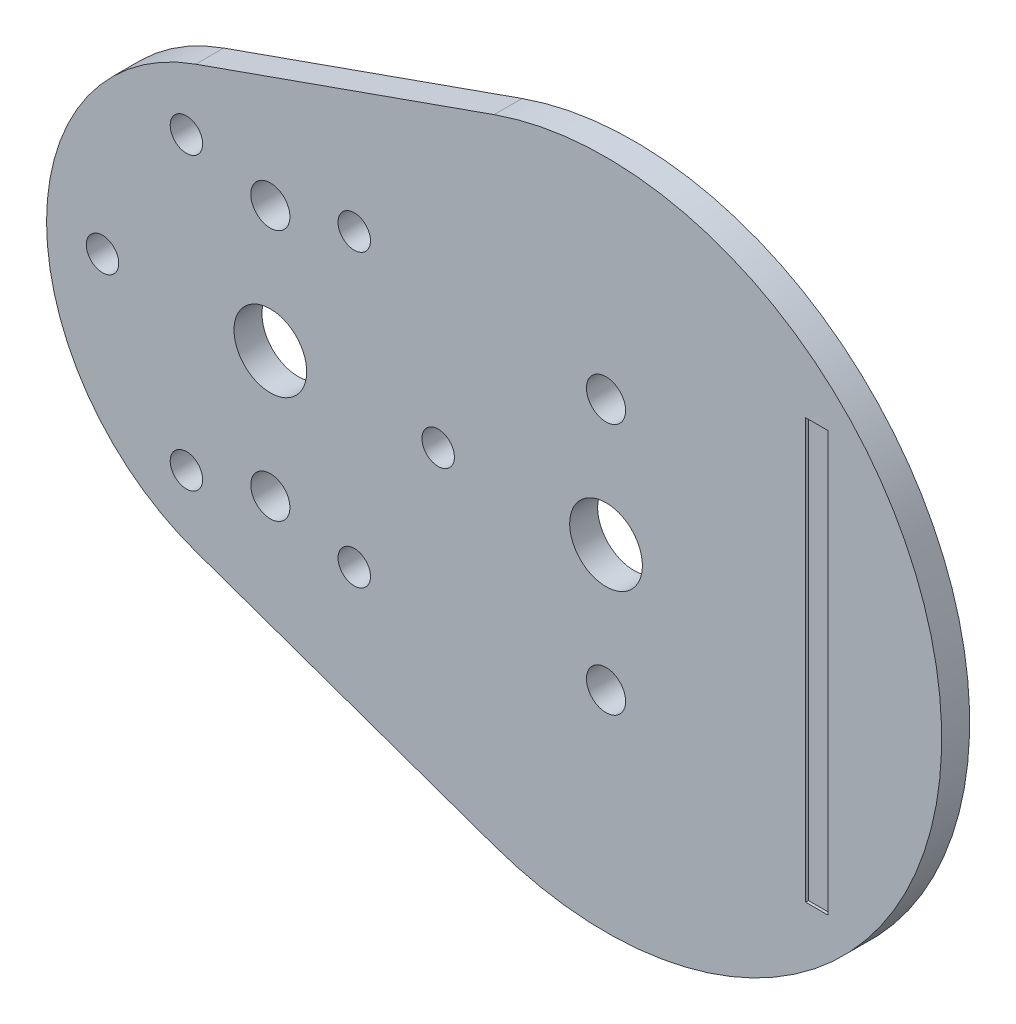
ISO-10303-21;
HEADER;
FILE_DESCRIPTION(('STEP AP214'),'2;1');
FILE_NAME('part.step','',(''),(''),'','','');
FILE_SCHEMA(('AUTOMOTIVE_DESIGN { 1 0 10303 214 1 1 1 1 }'));
ENDSEC;
DATA;
#1=APPLICATION_CONTEXT('core data for automotive mechanical design processes');
#2=APPLICATION_PROTOCOL_DEFINITION('international standard','automotive_design',2000,#1);
#3=PRODUCT_CONTEXT('',#1,'mechanical');
#4=PRODUCT('Part','Part','',(#3));
#5=PRODUCT_RELATED_PRODUCT_CATEGORY('part','',(#4));
#6=PRODUCT_DEFINITION_FORMATION('','',#4);
#7=PRODUCT_DEFINITION_CONTEXT('part definition',#1,'design');
#8=PRODUCT_DEFINITION('design','',#6,#7);
#9=PRODUCT_DEFINITION_SHAPE('','',#8);
#10=(LENGTH_UNIT() NAMED_UNIT(*) SI_UNIT(.MILLI.,.METRE.));
#11=(NAMED_UNIT(*) PLANE_ANGLE_UNIT() SI_UNIT($,.RADIAN.));
#12=(NAMED_UNIT(*) SI_UNIT($,.STERADIAN.) SOLID_ANGLE_UNIT());
#13=UNCERTAINTY_MEASURE_WITH_UNIT(LENGTH_MEASURE(1.E-05),#10,'distance_accuracy_value','');
#14=(GEOMETRIC_REPRESENTATION_CONTEXT(3) GLOBAL_UNCERTAINTY_ASSIGNED_CONTEXT((#13)) GLOBAL_UNIT_ASSIGNED_CONTEXT((#10,
#11,#12)) REPRESENTATION_CONTEXT('',''));
#15=CARTESIAN_POINT('',(0.,0.,0.));
#16=DIRECTION('',(0.,0.,1.));
#17=DIRECTION('',(1.,0.,0.));
#18=AXIS2_PLACEMENT_3D('',#15,#16,#17);
#19=CARTESIAN_POINT('',(0.,0.,5.));
#20=DIRECTION('',(0.,0.,-1.));
#21=DIRECTION('',(-1.,0.,0.));
#22=AXIS2_PLACEMENT_3D('',#19,#20,#21);
#23=PLANE('',#22);
#24=CARTESIAN_POINT('',(0.,0.,5.));
#25=DIRECTION('',(0.,0.,-1.));
#26=DIRECTION('',(-1.,0.,0.));
#27=AXIS2_PLACEMENT_3D('',#24,#25,#26);
#28=CIRCLE('',#27,60.);
#29=CARTESIAN_POINT('',(-20.,56.5685424949238,5.));
#30=VERTEX_POINT('',#29);
#31=CARTESIAN_POINT('',(-20.,-56.5685424949238,5.));
#32=VERTEX_POINT('',#31);
#33=EDGE_CURVE('E85',#30,#32,#28,.T.);
#34=ORIENTED_EDGE('',*,*,#33,.F.);
#35=DIRECTION('',(-0.942809041582063,-0.333333333333333,0.));
#36=VECTOR('',#35,1.);
#37=CARTESIAN_POINT('',(-20.,56.5685424949238,5.));
#38=LINE('',#37,#36);
#39=CARTESIAN_POINT('',(-73.3333333333333,37.7123616632826,5.));
#40=VERTEX_POINT('',#39);
#41=EDGE_CURVE('E195',#30,#40,#38,.T.);
#42=ORIENTED_EDGE('',*,*,#41,.T.);
#43=CARTESIAN_POINT('',(-60.,0.,5.));
#44=DIRECTION('',(0.,0.,-1.));
#45=DIRECTION('',(-1.,0.,0.));
#46=AXIS2_PLACEMENT_3D('',#43,#44,#45);
#47=CIRCLE('',#46,40.);
#48=CARTESIAN_POINT('',(-73.3333333333333,-37.7123616632825,5.));
#49=VERTEX_POINT('',#48);
#50=EDGE_CURVE('E192',#49,#40,#47,.T.);
#51=ORIENTED_EDGE('',*,*,#50,.F.);
#52=DIRECTION('',(0.942809041582063,-0.333333333333333,0.));
#53=VECTOR('',#52,1.);
#54=CARTESIAN_POINT('',(-73.3333333333333,-37.7123616632825,5.));
#55=LINE('',#54,#53);
#56=EDGE_CURVE('E189',#49,#32,#55,.T.);
#57=ORIENTED_EDGE('',*,*,#56,.T.);
#58=EDGE_LOOP('',(#34,#42,#51,#57));
#59=FACE_BOUND('',#58,.T.);
#60=CARTESIAN_POINT('',(3.95677291189683E-13,22.4999999999974,5.));
#61=DIRECTION('',(0.,0.,-1.));
#62=DIRECTION('',(-1.,0.,0.));
#63=AXIS2_PLACEMENT_3D('',#60,#61,#62);
#64=CIRCLE('',#63,3.49999999999999);
#65=CARTESIAN_POINT('',(-3.49999999999959,22.4999999999974,5.));
#66=VERTEX_POINT('',#65);
#67=EDGE_CURVE('E172',#66,#66,#64,.T.);
#68=ORIENTED_EDGE('',*,*,#67,.T.);
#69=EDGE_LOOP('',(#68));
#70=FACE_BOUND('',#69,.T.);
#71=CARTESIAN_POINT('',(3.95677291189683E-13,-22.5000000000026,5.));
#72=DIRECTION('',(0.,0.,-1.));
#73=DIRECTION('',(-1.,0.,0.));
#74=AXIS2_PLACEMENT_3D('',#71,#72,#73);
#75=CIRCLE('',#74,3.49999999999997);
#76=CARTESIAN_POINT('',(-3.49999999999958,-22.5000000000026,5.));
#77=VERTEX_POINT('',#76);
#78=EDGE_CURVE('E177',#77,#77,#75,.T.);
#79=ORIENTED_EDGE('',*,*,#78,.T.);
#80=EDGE_LOOP('',(#79));
#81=FACE_BOUND('',#80,.T.);
#82=CARTESIAN_POINT('',(-59.9999999999996,-22.5000000000026,5.));
#83=DIRECTION('',(0.,0.,-1.));
#84=DIRECTION('',(-1.,0.,0.));
#85=AXIS2_PLACEMENT_3D('',#82,#83,#84);
#86=CIRCLE('',#85,3.5);
#87=CARTESIAN_POINT('',(-63.4999999999996,-22.5000000000026,5.));
#88=VERTEX_POINT('',#87);
#89=EDGE_CURVE('E181',#88,#88,#86,.T.);
#90=ORIENTED_EDGE('',*,*,#89,.T.);
#91=EDGE_LOOP('',(#90));
#92=FACE_BOUND('',#91,.T.);
#93=CARTESIAN_POINT('',(-59.9999999999996,22.4999999999974,5.));
#94=DIRECTION('',(0.,0.,-1.));
#95=DIRECTION('',(-1.,0.,0.));
#96=AXIS2_PLACEMENT_3D('',#93,#94,#95);
#97=CIRCLE('',#96,3.5);
#98=CARTESIAN_POINT('',(-63.4999999999996,22.4999999999974,5.));
#99=VERTEX_POINT('',#98);
#100=EDGE_CURVE('E185',#99,#99,#97,.T.);
#101=ORIENTED_EDGE('',*,*,#100,.T.);
#102=EDGE_LOOP('',(#101));
#103=FACE_BOUND('',#102,.T.);
#104=CARTESIAN_POINT('',(-60.0000000000004,-1.97250984110758E-12,5.));
#105=DIRECTION('',(0.,0.,-1.));
#106=DIRECTION('',(0.,1.,0.));
#107=AXIS2_PLACEMENT_3D('',#104,#105,#106);
#108=CIRCLE('',#107,6.50000000000043);
#109=CARTESIAN_POINT('',(-60.0000000000004,6.49999999999846,5.));
#110=VERTEX_POINT('',#109);
#111=EDGE_CURVE('E165',#110,#110,#108,.T.);
#112=ORIENTED_EDGE('',*,*,#111,.T.);
#113=EDGE_LOOP('',(#112));
#114=FACE_BOUND('',#113,.T.);
#115=CARTESIAN_POINT('',(4.1286418728248E-13,-1.97424017550411E-12,5.));
#116=DIRECTION('',(0.,0.,-1.));
#117=DIRECTION('',(0.,1.,0.));
#118=AXIS2_PLACEMENT_3D('',#115,#116,#117);
#119=CIRCLE('',#118,6.49999999999999);
#120=CARTESIAN_POINT('',(4.1286418728248E-13,6.49999999999801,5.));
#121=VERTEX_POINT('',#120);
#122=EDGE_CURVE('E166',#121,#121,#119,.T.);
#123=ORIENTED_EDGE('',*,*,#122,.T.);
#124=EDGE_LOOP('',(#123));
#125=FACE_BOUND('',#124,.T.);
#126=CARTESIAN_POINT('',(-89.9999999999997,-1.32949725240404E-12,5.));
#127=DIRECTION('',(0.,0.,-1.));
#128=DIRECTION('',(-1.,0.,0.));
#129=AXIS2_PLACEMENT_3D('',#126,#127,#128);
#130=CIRCLE('',#129,2.89999999999999);
#131=CARTESIAN_POINT('',(-92.8999999999997,-1.32949725240404E-12,5.));
#132=VERTEX_POINT('',#131);
#133=EDGE_CURVE('E162',#132,#132,#130,.T.);
#134=ORIENTED_EDGE('',*,*,#133,.T.);
#135=EDGE_LOOP('',(#134));
#136=FACE_BOUND('',#135,.T.);
#137=CARTESIAN_POINT('',(-75.0000000000003,-25.9807621135349,5.));
#138=DIRECTION('',(0.,0.,-1.));
#139=DIRECTION('',(-1.,0.,0.));
#140=AXIS2_PLACEMENT_3D('',#137,#138,#139);
#141=CIRCLE('',#140,2.89999999999999);
#142=CARTESIAN_POINT('',(-77.9000000000002,-25.9807621135349,5.));
#143=VERTEX_POINT('',#142);
#144=EDGE_CURVE('E158',#143,#143,#141,.T.);
#145=ORIENTED_EDGE('',*,*,#144,.T.);
#146=EDGE_LOOP('',(#145));
#147=FACE_BOUND('',#146,.T.);
#148=CARTESIAN_POINT('',(-45.0000000000002,-25.9807621135356,5.));
#149=DIRECTION('',(0.,0.,-1.));
#150=DIRECTION('',(-1.,0.,0.));
#151=AXIS2_PLACEMENT_3D('',#148,#149,#150);
#152=CIRCLE('',#151,2.89999999999999);
#153=CARTESIAN_POINT('',(-47.9000000000002,-25.9807621135356,5.));
#154=VERTEX_POINT('',#153);
#155=EDGE_CURVE('E154',#154,#154,#152,.T.);
#156=ORIENTED_EDGE('',*,*,#155,.T.);
#157=EDGE_LOOP('',(#156));
#158=FACE_BOUND('',#157,.T.);
#159=CARTESIAN_POINT('',(-29.9999999999996,-2.69539052728573E-12,5.));
#160=DIRECTION('',(0.,0.,-1.));
#161=DIRECTION('',(-1.,0.,0.));
#162=AXIS2_PLACEMENT_3D('',#159,#160,#161);
#163=CIRCLE('',#162,2.89999999999999);
#164=CARTESIAN_POINT('',(-32.8999999999995,-2.69539052728573E-12,5.));
#165=VERTEX_POINT('',#164);
#166=EDGE_CURVE('E150',#165,#165,#163,.T.);
#167=ORIENTED_EDGE('',*,*,#166,.T.);
#168=EDGE_LOOP('',(#167));
#169=FACE_BOUND('',#168,.T.);
#170=CARTESIAN_POINT('',(-44.9999999999989,25.9807621135308,5.));
#171=DIRECTION('',(0.,0.,-1.));
#172=DIRECTION('',(-1.,0.,0.));
#173=AXIS2_PLACEMENT_3D('',#170,#171,#172);
#174=CIRCLE('',#173,2.89999999999999);
#175=CARTESIAN_POINT('',(-47.8999999999989,25.9807621135308,5.));
#176=VERTEX_POINT('',#175);
#177=EDGE_CURVE('E146',#176,#176,#174,.T.);
#178=ORIENTED_EDGE('',*,*,#177,.T.);
#179=EDGE_LOOP('',(#178));
#180=FACE_BOUND('',#179,.T.);
#181=CARTESIAN_POINT('',(-74.999999999999,25.9807621135315,5.));
#182=DIRECTION('',(0.,0.,-1.));
#183=DIRECTION('',(-1.,0.,0.));
#184=AXIS2_PLACEMENT_3D('',#181,#182,#183);
#185=CIRCLE('',#184,2.89999999999999);
#186=CARTESIAN_POINT('',(-77.899999999999,25.9807621135315,5.));
#187=VERTEX_POINT('',#186);
#188=EDGE_CURVE('E133',#187,#187,#185,.T.);
#189=ORIENTED_EDGE('',*,*,#188,.T.);
#190=EDGE_LOOP('',(#189));
#191=FACE_BOUND('',#190,.T.);
#192=DIRECTION('',(-1.,0.,0.));
#193=VECTOR('',#192,1.);
#194=CARTESIAN_POINT('',(0.,37.4999999999982,5.));
#195=LINE('',#194,#193);
#196=CARTESIAN_POINT('',(39.6862696659694,37.4999999999982,5.));
#197=VERTEX_POINT('',#196);
#198=CARTESIAN_POINT('',(35.6862696659694,37.4999999999982,5.));
#199=VERTEX_POINT('',#198);
#200=EDGE_CURVE('E13',#197,#199,#195,.T.);
#201=ORIENTED_EDGE('',*,*,#200,.F.);
#202=DIRECTION('',(0.,1.,0.));
#203=VECTOR('',#202,1.);
#204=CARTESIAN_POINT('',(39.6862696659694,0.,5.));
#205=LINE('',#204,#203);
#206=CARTESIAN_POINT('',(39.6862696659694,-37.5000000000018,5.));
#207=VERTEX_POINT('',#206);
#208=EDGE_CURVE('E47',#207,#197,#205,.T.);
#209=ORIENTED_EDGE('',*,*,#208,.F.);
#210=DIRECTION('',(1.,0.,0.));
#211=VECTOR('',#210,1.);
#212=CARTESIAN_POINT('',(0.,-37.5000000000018,5.));
#213=LINE('',#212,#211);
#214=CARTESIAN_POINT('',(35.6862696659694,-37.5000000000018,5.));
#215=VERTEX_POINT('',#214);
#216=EDGE_CURVE('E236',#215,#207,#213,.T.);
#217=ORIENTED_EDGE('',*,*,#216,.F.);
#218=DIRECTION('',(0.,-1.,0.));
#219=VECTOR('',#218,1.);
#220=CARTESIAN_POINT('',(35.6862696659694,0.,5.));
#221=LINE('',#220,#219);
#222=EDGE_CURVE('E112',#199,#215,#221,.T.);
#223=ORIENTED_EDGE('',*,*,#222,.F.);
#224=EDGE_LOOP('',(#201,#209,#217,#223));
#225=FACE_BOUND('',#224,.T.);
#226=ADVANCED_FACE('F39',(#59,#70,#81,#92,#103,#114,#125,#136,#147,#158,#169,#180,#191,#225),
#23,.F.);
#227=CARTESIAN_POINT('',(-20.,56.5685424949238,5.));
#228=DIRECTION('',(0.333333333333333,-0.942809041582063,0.));
#229=DIRECTION('',(0.942809041582064,0.333333333333333,0.));
#230=AXIS2_PLACEMENT_3D('',#227,#228,#229);
#231=PLANE('',#230);
#232=DIRECTION('',(-0.942809041582063,-0.333333333333333,0.));
#233=VECTOR('',#232,1.);
#234=CARTESIAN_POINT('',(-20.,56.5685424949238,0.));
#235=LINE('',#234,#233);
#236=CARTESIAN_POINT('',(-20.,56.5685424949238,0.));
#237=VERTEX_POINT('',#236);
#238=CARTESIAN_POINT('',(-73.3333333333333,37.7123616632826,0.));
#239=VERTEX_POINT('',#238);
#240=EDGE_CURVE('E190',#237,#239,#235,.T.);
#241=ORIENTED_EDGE('',*,*,#240,.T.);
#242=DIRECTION('',(0.,0.,-1.));
#243=VECTOR('',#242,1.);
#244=CARTESIAN_POINT('',(-73.3333333333333,37.7123616632826,5.));
#245=LINE('',#244,#243);
#246=EDGE_CURVE('E207',#40,#239,#245,.T.);
#247=ORIENTED_EDGE('',*,*,#246,.F.);
#248=ORIENTED_EDGE('',*,*,#41,.F.);
#249=DIRECTION('',(0.,0.,-1.));
#250=VECTOR('',#249,1.);
#251=CARTESIAN_POINT('',(-20.,56.5685424949238,5.));
#252=LINE('',#251,#250);
#253=EDGE_CURVE('E62',#30,#237,#252,.T.);
#254=ORIENTED_EDGE('',*,*,#253,.T.);
#255=EDGE_LOOP('',(#241,#247,#248,#254));
#256=FACE_BOUND('',#255,.T.);
#257=ADVANCED_FACE('F246',(#256),#231,.F.);
#258=CARTESIAN_POINT('',(-60.,0.,5.));
#259=DIRECTION('',(0.,0.,-1.));
#260=DIRECTION('',(-1.,0.,0.));
#261=AXIS2_PLACEMENT_3D('',#258,#259,#260);
#262=CYLINDRICAL_SURFACE('',#261,40.);
#263=CARTESIAN_POINT('',(-60.,0.,0.));
#264=DIRECTION('',(0.,0.,-1.));
#265=DIRECTION('',(-1.,0.,0.));
#266=AXIS2_PLACEMENT_3D('',#263,#264,#265);
#267=CIRCLE('',#266,40.);
#268=CARTESIAN_POINT('',(-73.3333333333333,-37.7123616632825,0.));
#269=VERTEX_POINT('',#268);
#270=EDGE_CURVE('E201',#269,#239,#267,.T.);
#271=ORIENTED_EDGE('',*,*,#270,.F.);
#272=DIRECTION('',(0.,0.,-1.));
#273=VECTOR('',#272,1.);
#274=CARTESIAN_POINT('',(-73.3333333333333,-37.7123616632825,5.));
#275=LINE('',#274,#273);
#276=EDGE_CURVE('E209',#49,#269,#275,.T.);
#277=ORIENTED_EDGE('',*,*,#276,.F.);
#278=ORIENTED_EDGE('',*,*,#50,.T.);
#279=ORIENTED_EDGE('',*,*,#246,.T.);
#280=EDGE_LOOP('',(#271,#277,#278,#279));
#281=FACE_BOUND('',#280,.T.);
#282=ADVANCED_FACE('F254',(#281),#262,.T.);
#283=CARTESIAN_POINT('',(-73.3333333333333,-37.7123616632825,5.));
#284=DIRECTION('',(0.333333333333333,0.942809041582063,0.));
#285=DIRECTION('',(-0.942809041582064,0.333333333333333,0.));
#286=AXIS2_PLACEMENT_3D('',#283,#284,#285);
#287=PLANE('',#286);
#288=DIRECTION('',(0.942809041582063,-0.333333333333333,0.));
#289=VECTOR('',#288,1.);
#290=CARTESIAN_POINT('',(-73.3333333333333,-37.7123616632825,0.));
#291=LINE('',#290,#289);
#292=CARTESIAN_POINT('',(-20.,-56.5685424949238,0.));
#293=VERTEX_POINT('',#292);
#294=EDGE_CURVE('E199',#269,#293,#291,.T.);
#295=ORIENTED_EDGE('',*,*,#294,.T.);
#296=DIRECTION('',(0.,0.,-1.));
#297=VECTOR('',#296,1.);
#298=CARTESIAN_POINT('',(-20.,-56.5685424949238,5.));
#299=LINE('',#298,#297);
#300=EDGE_CURVE('E197',#32,#293,#299,.T.);
#301=ORIENTED_EDGE('',*,*,#300,.F.);
#302=ORIENTED_EDGE('',*,*,#56,.F.);
#303=ORIENTED_EDGE('',*,*,#276,.T.);
#304=EDGE_LOOP('',(#295,#301,#302,#303));
#305=FACE_BOUND('',#304,.T.);
#306=ADVANCED_FACE('F267',(#305),#287,.F.);
#307=CARTESIAN_POINT('',(0.,0.,5.));
#308=DIRECTION('',(0.,0.,-1.));
#309=DIRECTION('',(-1.,0.,0.));
#310=AXIS2_PLACEMENT_3D('',#307,#308,#309);
#311=CYLINDRICAL_SURFACE('',#310,60.);
#312=CARTESIAN_POINT('',(0.,0.,0.));
#313=DIRECTION('',(0.,0.,1.));
#314=DIRECTION('',(1.,0.,0.));
#315=AXIS2_PLACEMENT_3D('',#312,#313,#314);
#316=CIRCLE('',#315,60.);
#317=EDGE_CURVE('E82',#293,#237,#316,.T.);
#318=ORIENTED_EDGE('',*,*,#317,.T.);
#319=ORIENTED_EDGE('',*,*,#253,.F.);
#320=ORIENTED_EDGE('',*,*,#33,.T.);
#321=ORIENTED_EDGE('',*,*,#300,.T.);
#322=EDGE_LOOP('',(#318,#319,#320,#321));
#323=FACE_BOUND('',#322,.T.);
#324=ADVANCED_FACE('F41',(#323),#311,.T.);
#325=CARTESIAN_POINT('',(0.,0.,0.));
#326=DIRECTION('',(0.,0.,-1.));
#327=DIRECTION('',(-1.,0.,0.));
#328=AXIS2_PLACEMENT_3D('',#325,#326,#327);
#329=PLANE('',#328);
#330=CARTESIAN_POINT('',(-74.999999999999,25.9807621135315,0.));
#331=DIRECTION('',(0.,0.,-1.));
#332=DIRECTION('',(-1.,0.,0.));
#333=AXIS2_PLACEMENT_3D('',#330,#331,#332);
#334=CIRCLE('',#333,2.89999999999999);
#335=CARTESIAN_POINT('',(-77.899999999999,25.9807621135315,0.));
#336=VERTEX_POINT('',#335);
#337=EDGE_CURVE('E129',#336,#336,#334,.T.);
#338=ORIENTED_EDGE('',*,*,#337,.F.);
#339=EDGE_LOOP('',(#338));
#340=FACE_BOUND('',#339,.T.);
#341=CARTESIAN_POINT('',(-44.9999999999989,25.9807621135308,0.));
#342=DIRECTION('',(0.,0.,-1.));
#343=DIRECTION('',(-1.,0.,0.));
#344=AXIS2_PLACEMENT_3D('',#341,#342,#343);
#345=CIRCLE('',#344,2.89999999999999);
#346=CARTESIAN_POINT('',(-47.8999999999989,25.9807621135308,0.));
#347=VERTEX_POINT('',#346);
#348=EDGE_CURVE('E145',#347,#347,#345,.T.);
#349=ORIENTED_EDGE('',*,*,#348,.F.);
#350=EDGE_LOOP('',(#349));
#351=FACE_BOUND('',#350,.T.);
#352=CARTESIAN_POINT('',(-29.9999999999996,-2.69539052728573E-12,0.));
#353=DIRECTION('',(0.,0.,-1.));
#354=DIRECTION('',(-1.,0.,0.));
#355=AXIS2_PLACEMENT_3D('',#352,#353,#354);
#356=CIRCLE('',#355,2.89999999999999);
#357=CARTESIAN_POINT('',(-32.8999999999995,-2.69539052728573E-12,0.));
#358=VERTEX_POINT('',#357);
#359=EDGE_CURVE('E149',#358,#358,#356,.T.);
#360=ORIENTED_EDGE('',*,*,#359,.F.);
#361=EDGE_LOOP('',(#360));
#362=FACE_BOUND('',#361,.T.);
#363=CARTESIAN_POINT('',(-45.0000000000002,-25.9807621135356,0.));
#364=DIRECTION('',(0.,0.,-1.));
#365=DIRECTION('',(-1.,0.,0.));
#366=AXIS2_PLACEMENT_3D('',#363,#364,#365);
#367=CIRCLE('',#366,2.89999999999999);
#368=CARTESIAN_POINT('',(-47.9000000000002,-25.9807621135356,0.));
#369=VERTEX_POINT('',#368);
#370=EDGE_CURVE('E153',#369,#369,#367,.T.);
#371=ORIENTED_EDGE('',*,*,#370,.F.);
#372=EDGE_LOOP('',(#371));
#373=FACE_BOUND('',#372,.T.);
#374=CARTESIAN_POINT('',(-75.0000000000003,-25.9807621135349,0.));
#375=DIRECTION('',(0.,0.,-1.));
#376=DIRECTION('',(-1.,0.,0.));
#377=AXIS2_PLACEMENT_3D('',#374,#375,#376);
#378=CIRCLE('',#377,2.89999999999999);
#379=CARTESIAN_POINT('',(-77.9000000000002,-25.9807621135349,0.));
#380=VERTEX_POINT('',#379);
#381=EDGE_CURVE('E157',#380,#380,#378,.T.);
#382=ORIENTED_EDGE('',*,*,#381,.F.);
#383=EDGE_LOOP('',(#382));
#384=FACE_BOUND('',#383,.T.);
#385=CARTESIAN_POINT('',(-89.9999999999997,-1.32949725240404E-12,0.));
#386=DIRECTION('',(0.,0.,-1.));
#387=DIRECTION('',(-1.,0.,0.));
#388=AXIS2_PLACEMENT_3D('',#385,#386,#387);
#389=CIRCLE('',#388,2.89999999999999);
#390=CARTESIAN_POINT('',(-92.8999999999997,-1.32949725240404E-12,0.));
#391=VERTEX_POINT('',#390);
#392=EDGE_CURVE('E161',#391,#391,#389,.T.);
#393=ORIENTED_EDGE('',*,*,#392,.F.);
#394=EDGE_LOOP('',(#393));
#395=FACE_BOUND('',#394,.T.);
#396=CARTESIAN_POINT('',(4.1286418728248E-13,-1.97423163579395E-12,0.));
#397=DIRECTION('',(0.,0.,-1.));
#398=DIRECTION('',(-1.,0.,0.));
#399=AXIS2_PLACEMENT_3D('',#396,#397,#398);
#400=CIRCLE('',#399,6.49999999999999);
#401=CARTESIAN_POINT('',(4.1286418728248E-13,6.49999999999801,0.));
#402=VERTEX_POINT('',#401);
#403=EDGE_CURVE('E214',#402,#402,#400,.T.);
#404=ORIENTED_EDGE('',*,*,#403,.F.);
#405=EDGE_LOOP('',(#404));
#406=FACE_BOUND('',#405,.T.);
#407=CARTESIAN_POINT('',(-60.0000000000004,-1.97250130139743E-12,0.));
#408=DIRECTION('',(0.,0.,-1.));
#409=DIRECTION('',(-1.,0.,0.));
#410=AXIS2_PLACEMENT_3D('',#407,#408,#409);
#411=CIRCLE('',#410,6.50000000000043);
#412=CARTESIAN_POINT('',(-60.0000000000004,6.49999999999846,0.));
#413=VERTEX_POINT('',#412);
#414=EDGE_CURVE('E169',#413,#413,#411,.T.);
#415=ORIENTED_EDGE('',*,*,#414,.F.);
#416=EDGE_LOOP('',(#415));
#417=FACE_BOUND('',#416,.T.);
#418=CARTESIAN_POINT('',(-59.9999999999996,22.4999999999974,0.));
#419=DIRECTION('',(0.,0.,-1.));
#420=DIRECTION('',(-1.,0.,0.));
#421=AXIS2_PLACEMENT_3D('',#418,#419,#420);
#422=CIRCLE('',#421,3.5);
#423=CARTESIAN_POINT('',(-63.4999999999996,22.4999999999974,0.));
#424=VERTEX_POINT('',#423);
#425=EDGE_CURVE('E184',#424,#424,#422,.T.);
#426=ORIENTED_EDGE('',*,*,#425,.F.);
#427=EDGE_LOOP('',(#426));
#428=FACE_BOUND('',#427,.T.);
#429=CARTESIAN_POINT('',(-59.9999999999996,-22.5000000000026,0.));
#430=DIRECTION('',(0.,0.,-1.));
#431=DIRECTION('',(-1.,0.,0.));
#432=AXIS2_PLACEMENT_3D('',#429,#430,#431);
#433=CIRCLE('',#432,3.5);
#434=CARTESIAN_POINT('',(-63.4999999999996,-22.5000000000026,0.));
#435=VERTEX_POINT('',#434);
#436=EDGE_CURVE('E180',#435,#435,#433,.T.);
#437=ORIENTED_EDGE('',*,*,#436,.F.);
#438=EDGE_LOOP('',(#437));
#439=FACE_BOUND('',#438,.T.);
#440=CARTESIAN_POINT('',(3.95600939443506E-13,-22.5000000000026,0.));
#441=DIRECTION('',(0.,0.,-1.));
#442=DIRECTION('',(-1.,0.,0.));
#443=AXIS2_PLACEMENT_3D('',#440,#441,#442);
#444=CIRCLE('',#443,3.49999999999997);
#445=CARTESIAN_POINT('',(-3.49999999999958,-22.5000000000026,0.));
#446=VERTEX_POINT('',#445);
#447=EDGE_CURVE('E175',#446,#446,#444,.T.);
#448=ORIENTED_EDGE('',*,*,#447,.F.);
#449=EDGE_LOOP('',(#448));
#450=FACE_BOUND('',#449,.T.);
#451=CARTESIAN_POINT('',(3.95600939443506E-13,22.4999999999974,0.));
#452=DIRECTION('',(0.,0.,-1.));
#453=DIRECTION('',(-1.,0.,0.));
#454=AXIS2_PLACEMENT_3D('',#451,#452,#453);
#455=CIRCLE('',#454,3.49999999999999);
#456=CARTESIAN_POINT('',(-3.49999999999959,22.4999999999974,0.));
#457=VERTEX_POINT('',#456);
#458=EDGE_CURVE('E176',#457,#457,#455,.T.);
#459=ORIENTED_EDGE('',*,*,#458,.F.);
#460=EDGE_LOOP('',(#459));
#461=FACE_BOUND('',#460,.T.);
#462=ORIENTED_EDGE('',*,*,#240,.F.);
#463=ORIENTED_EDGE('',*,*,#317,.F.);
#464=ORIENTED_EDGE('',*,*,#294,.F.);
#465=ORIENTED_EDGE('',*,*,#270,.T.);
#466=EDGE_LOOP('',(#462,#463,#464,#465));
#467=FACE_BOUND('',#466,.T.);
#468=ADVANCED_FACE('F262',(#340,#351,#362,#373,#384,#395,#406,#417,#428,#439,#450,#461,#467),
#329,.T.);
#469=CARTESIAN_POINT('',(3.95600939443506E-13,22.4999999999974,0.));
#470=DIRECTION('',(0.,0.,-1.));
#471=DIRECTION('',(-1.,0.,0.));
#472=AXIS2_PLACEMENT_3D('',#469,#470,#471);
#473=CYLINDRICAL_SURFACE('',#472,3.49999999999999);
#474=ORIENTED_EDGE('',*,*,#458,.T.);
#475=EDGE_LOOP('',(#474));
#476=FACE_BOUND('',#475,.T.);
#477=ORIENTED_EDGE('',*,*,#67,.F.);
#478=EDGE_LOOP('',(#477));
#479=FACE_BOUND('',#478,.T.);
#480=ADVANCED_FACE('F260',(#476,#479),#473,.F.);
#481=CARTESIAN_POINT('',(3.95600939443506E-13,-22.5000000000026,0.));
#482=DIRECTION('',(0.,0.,-1.));
#483=DIRECTION('',(-1.,0.,0.));
#484=AXIS2_PLACEMENT_3D('',#481,#482,#483);
#485=CYLINDRICAL_SURFACE('',#484,3.49999999999997);
#486=ORIENTED_EDGE('',*,*,#447,.T.);
#487=EDGE_LOOP('',(#486));
#488=FACE_BOUND('',#487,.T.);
#489=ORIENTED_EDGE('',*,*,#78,.F.);
#490=EDGE_LOOP('',(#489));
#491=FACE_BOUND('',#490,.T.);
#492=ADVANCED_FACE('F307',(#488,#491),#485,.F.);
#493=CARTESIAN_POINT('',(-59.9999999999996,-22.5000000000026,0.));
#494=DIRECTION('',(0.,0.,-1.));
#495=DIRECTION('',(-1.,0.,0.));
#496=AXIS2_PLACEMENT_3D('',#493,#494,#495);
#497=CYLINDRICAL_SURFACE('',#496,3.5);
#498=ORIENTED_EDGE('',*,*,#436,.T.);
#499=EDGE_LOOP('',(#498));
#500=FACE_BOUND('',#499,.T.);
#501=ORIENTED_EDGE('',*,*,#89,.F.);
#502=EDGE_LOOP('',(#501));
#503=FACE_BOUND('',#502,.T.);
#504=ADVANCED_FACE('F313',(#500,#503),#497,.F.);
#505=CARTESIAN_POINT('',(-59.9999999999996,22.4999999999974,0.));
#506=DIRECTION('',(0.,0.,-1.));
#507=DIRECTION('',(-1.,0.,0.));
#508=AXIS2_PLACEMENT_3D('',#505,#506,#507);
#509=CYLINDRICAL_SURFACE('',#508,3.5);
#510=ORIENTED_EDGE('',*,*,#425,.T.);
#511=EDGE_LOOP('',(#510));
#512=FACE_BOUND('',#511,.T.);
#513=ORIENTED_EDGE('',*,*,#100,.F.);
#514=EDGE_LOOP('',(#513));
#515=FACE_BOUND('',#514,.T.);
#516=ADVANCED_FACE('F321',(#512,#515),#509,.F.);
#517=CARTESIAN_POINT('',(-60.0000000000004,-1.97250984110758E-12,5.));
#518=DIRECTION('',(0.,0.,-1.));
#519=DIRECTION('',(0.,1.,0.));
#520=AXIS2_PLACEMENT_3D('',#517,#518,#519);
#521=CYLINDRICAL_SURFACE('',#520,6.50000000000043);
#522=CARTESIAN_POINT('',(-60.0000000000004,6.49999999999846,0.));
#523=CARTESIAN_POINT('',(-60.0000000000004,6.49999999999846,0.0520833333333342));
#524=CARTESIAN_POINT('',(-60.0000000000004,6.49999999999846,0.104166666666668));
#525=CARTESIAN_POINT('',(-60.0000000000004,6.49999999999846,0.208333333333334));
#526=CARTESIAN_POINT('',(-60.0000000000004,6.49999999999846,0.260416666666668));
#527=CARTESIAN_POINT('',(-60.0000000000004,6.49999999999846,0.364583333333334));
#528=CARTESIAN_POINT('',(-60.0000000000004,6.49999999999846,0.416666666666668));
#529=CARTESIAN_POINT('',(-60.0000000000004,6.49999999999846,0.520833333333335));
#530=CARTESIAN_POINT('',(-60.0000000000004,6.49999999999846,0.572916666666668));
#531=CARTESIAN_POINT('',(-60.0000000000004,6.49999999999846,0.677083333333335));
#532=CARTESIAN_POINT('',(-60.0000000000004,6.49999999999846,0.729166666666668));
#533=CARTESIAN_POINT('',(-60.0000000000004,6.49999999999846,0.833333333333335));
#534=CARTESIAN_POINT('',(-60.0000000000004,6.49999999999846,0.885416666666668));
#535=CARTESIAN_POINT('',(-60.0000000000004,6.49999999999846,0.989583333333335));
#536=CARTESIAN_POINT('',(-60.0000000000004,6.49999999999846,1.04166666666667));
#537=CARTESIAN_POINT('',(-60.0000000000004,6.49999999999846,1.14583333333334));
#538=CARTESIAN_POINT('',(-60.0000000000004,6.49999999999846,1.19791666666667));
#539=CARTESIAN_POINT('',(-60.0000000000004,6.49999999999846,1.30208333333334));
#540=CARTESIAN_POINT('',(-60.0000000000004,6.49999999999846,1.35416666666667));
#541=CARTESIAN_POINT('',(-60.0000000000004,6.49999999999846,1.45833333333334));
#542=CARTESIAN_POINT('',(-60.0000000000004,6.49999999999846,1.51041666666667));
#543=CARTESIAN_POINT('',(-60.0000000000004,6.49999999999846,1.61458333333334));
#544=CARTESIAN_POINT('',(-60.0000000000004,6.49999999999846,1.66666666666667));
#545=CARTESIAN_POINT('',(-60.0000000000004,6.49999999999846,1.77083333333334));
#546=CARTESIAN_POINT('',(-60.0000000000004,6.49999999999846,1.82291666666667));
#547=CARTESIAN_POINT('',(-60.0000000000004,6.49999999999846,1.92708333333334));
#548=CARTESIAN_POINT('',(-60.0000000000004,6.49999999999846,1.97916666666667));
#549=CARTESIAN_POINT('',(-60.0000000000004,6.49999999999846,2.08333333333334));
#550=CARTESIAN_POINT('',(-60.0000000000004,6.49999999999846,2.13541666666667));
#551=CARTESIAN_POINT('',(-60.0000000000004,6.49999999999846,2.23958333333334));
#552=CARTESIAN_POINT('',(-60.0000000000004,6.49999999999846,2.29166666666667));
#553=CARTESIAN_POINT('',(-60.0000000000004,6.49999999999846,2.39583333333334));
#554=CARTESIAN_POINT('',(-60.0000000000004,6.49999999999846,2.44791666666667));
#555=CARTESIAN_POINT('',(-60.0000000000004,6.49999999999846,2.55208333333334));
#556=CARTESIAN_POINT('',(-60.0000000000004,6.49999999999846,2.60416666666667));
#557=CARTESIAN_POINT('',(-60.0000000000004,6.49999999999846,2.70833333333334));
#558=CARTESIAN_POINT('',(-60.0000000000004,6.49999999999846,2.76041666666667));
#559=CARTESIAN_POINT('',(-60.0000000000004,6.49999999999846,2.86458333333334));
#560=CARTESIAN_POINT('',(-60.0000000000004,6.49999999999846,2.91666666666667));
#561=CARTESIAN_POINT('',(-60.0000000000004,6.49999999999846,3.02083333333334));
#562=CARTESIAN_POINT('',(-60.0000000000004,6.49999999999846,3.07291666666667));
#563=CARTESIAN_POINT('',(-60.0000000000004,6.49999999999846,3.17708333333334));
#564=CARTESIAN_POINT('',(-60.0000000000004,6.49999999999846,3.22916666666667));
#565=CARTESIAN_POINT('',(-60.0000000000004,6.49999999999846,3.33333333333334));
#566=CARTESIAN_POINT('',(-60.0000000000004,6.49999999999846,3.38541666666667));
#567=CARTESIAN_POINT('',(-60.0000000000004,6.49999999999846,3.48958333333334));
#568=CARTESIAN_POINT('',(-60.0000000000004,6.49999999999846,3.54166666666667));
#569=CARTESIAN_POINT('',(-60.0000000000004,6.49999999999846,3.64583333333334));
#570=CARTESIAN_POINT('',(-60.0000000000004,6.49999999999846,3.69791666666667));
#571=CARTESIAN_POINT('',(-60.0000000000004,6.49999999999846,3.80208333333334));
#572=CARTESIAN_POINT('',(-60.0000000000004,6.49999999999846,3.85416666666667));
#573=CARTESIAN_POINT('',(-60.0000000000004,6.49999999999846,3.95833333333334));
#574=CARTESIAN_POINT('',(-60.0000000000004,6.49999999999846,4.01041666666667));
#575=CARTESIAN_POINT('',(-60.0000000000004,6.49999999999846,4.11458333333334));
#576=CARTESIAN_POINT('',(-60.0000000000004,6.49999999999846,4.16666666666667));
#577=CARTESIAN_POINT('',(-60.0000000000004,6.49999999999846,4.27083333333334));
#578=CARTESIAN_POINT('',(-60.0000000000004,6.49999999999846,4.32291666666667));
#579=CARTESIAN_POINT('',(-60.0000000000004,6.49999999999846,4.42708333333334));
#580=CARTESIAN_POINT('',(-60.0000000000004,6.49999999999846,4.47916666666667));
#581=CARTESIAN_POINT('',(-60.0000000000004,6.49999999999846,4.58333333333334));
#582=CARTESIAN_POINT('',(-60.0000000000004,6.49999999999846,4.63541666666667));
#583=CARTESIAN_POINT('',(-60.0000000000004,6.49999999999846,4.73958333333334));
#584=CARTESIAN_POINT('',(-60.0000000000004,6.49999999999846,4.79166666666667));
#585=CARTESIAN_POINT('',(-60.0000000000004,6.49999999999846,4.89583333333334));
#586=CARTESIAN_POINT('',(-60.0000000000004,6.49999999999846,4.94791666666667));
#587=CARTESIAN_POINT('',(-60.0000000000004,6.49999999999846,5.));
#588=B_SPLINE_CURVE_WITH_KNOTS('',3,(#522,#523,#524,#525,#526,#527,#528,#529,#530,#531,#532,
#533,#534,#535,#536,#537,#538,#539,#540,#541,#542,#543,#544,#545,#546,#547,#548,#549,#550,#551,
#552,#553,#554,#555,#556,#557,#558,#559,#560,#561,#562,#563,#564,#565,#566,#567,#568,#569,#570,
#571,#572,#573,#574,#575,#576,#577,#578,#579,#580,#581,#582,#583,#584,#585,#586,#587),
.UNSPECIFIED.,.F.,.F.,(4,2,2,2,2,2,2,2,2,2,2,2,2,2,2,2,2,2,2,2,2,2,2,2,2,2,2,2,2,2,2,2,4),(0.,
0.15625,0.3125,0.46875,0.625000000000001,0.781250000000001,0.937500000000001,1.09375,1.25,
1.40625,1.5625,1.71875,1.875,2.03125,2.1875,2.34375,2.5,2.65625,2.8125,2.96875,3.125,3.28125,
3.4375,3.59375,3.75,3.90625,4.0625,4.21875,4.375,4.53125,4.6875,4.84375,5.),.UNSPECIFIED.);
#589=EDGE_CURVE('BSEAM329',#413,#110,#588,.T.);
#590=ORIENTED_EDGE('',*,*,#414,.T.);
#591=ORIENTED_EDGE('',*,*,#111,.F.);
#592=ORIENTED_EDGE('',*,*,#589,.T.);
#593=ORIENTED_EDGE('',*,*,#589,.F.);
#594=EDGE_LOOP('',(#590,#592,#591,#593));
#595=FACE_BOUND('',#594,.T.);
#596=ADVANCED_FACE('F329',(#595),#521,.F.);
#597=CARTESIAN_POINT('',(4.1286418728248E-13,-1.97424017550411E-12,5.));
#598=DIRECTION('',(0.,0.,-1.));
#599=DIRECTION('',(0.,1.,0.));
#600=AXIS2_PLACEMENT_3D('',#597,#598,#599);
#601=CYLINDRICAL_SURFACE('',#600,6.49999999999999);
#602=CARTESIAN_POINT('',(4.1286418728248E-13,6.49999999999801,0.));
#603=CARTESIAN_POINT('',(4.1286418728248E-13,6.49999999999801,0.0520833333333342));
#604=CARTESIAN_POINT('',(4.1286418728248E-13,6.49999999999801,0.104166666666668));
#605=CARTESIAN_POINT('',(4.1286418728248E-13,6.49999999999801,0.208333333333334));
#606=CARTESIAN_POINT('',(4.1286418728248E-13,6.49999999999801,0.260416666666668));
#607=CARTESIAN_POINT('',(4.1286418728248E-13,6.49999999999801,0.364583333333334));
#608=CARTESIAN_POINT('',(4.1286418728248E-13,6.49999999999801,0.416666666666668));
#609=CARTESIAN_POINT('',(4.1286418728248E-13,6.49999999999801,0.520833333333335));
#610=CARTESIAN_POINT('',(4.1286418728248E-13,6.49999999999801,0.572916666666668));
#611=CARTESIAN_POINT('',(4.1286418728248E-13,6.49999999999801,0.677083333333335));
#612=CARTESIAN_POINT('',(4.1286418728248E-13,6.49999999999801,0.729166666666668));
#613=CARTESIAN_POINT('',(4.1286418728248E-13,6.49999999999801,0.833333333333335));
#614=CARTESIAN_POINT('',(4.1286418728248E-13,6.49999999999801,0.885416666666668));
#615=CARTESIAN_POINT('',(4.1286418728248E-13,6.49999999999801,0.989583333333335));
#616=CARTESIAN_POINT('',(4.1286418728248E-13,6.49999999999801,1.04166666666667));
#617=CARTESIAN_POINT('',(4.1286418728248E-13,6.49999999999801,1.14583333333334));
#618=CARTESIAN_POINT('',(4.1286418728248E-13,6.49999999999801,1.19791666666667));
#619=CARTESIAN_POINT('',(4.1286418728248E-13,6.49999999999801,1.30208333333334));
#620=CARTESIAN_POINT('',(4.1286418728248E-13,6.49999999999801,1.35416666666667));
#621=CARTESIAN_POINT('',(4.1286418728248E-13,6.49999999999801,1.45833333333334));
#622=CARTESIAN_POINT('',(4.1286418728248E-13,6.49999999999801,1.51041666666667));
#623=CARTESIAN_POINT('',(4.1286418728248E-13,6.49999999999801,1.61458333333334));
#624=CARTESIAN_POINT('',(4.1286418728248E-13,6.49999999999801,1.66666666666667));
#625=CARTESIAN_POINT('',(4.1286418728248E-13,6.49999999999801,1.77083333333334));
#626=CARTESIAN_POINT('',(4.1286418728248E-13,6.49999999999801,1.82291666666667));
#627=CARTESIAN_POINT('',(4.1286418728248E-13,6.49999999999801,1.92708333333334));
#628=CARTESIAN_POINT('',(4.1286418728248E-13,6.49999999999801,1.97916666666667));
#629=CARTESIAN_POINT('',(4.1286418728248E-13,6.49999999999801,2.08333333333334));
#630=CARTESIAN_POINT('',(4.1286418728248E-13,6.49999999999801,2.13541666666667));
#631=CARTESIAN_POINT('',(4.1286418728248E-13,6.49999999999801,2.23958333333334));
#632=CARTESIAN_POINT('',(4.1286418728248E-13,6.49999999999801,2.29166666666667));
#633=CARTESIAN_POINT('',(4.1286418728248E-13,6.49999999999801,2.39583333333334));
#634=CARTESIAN_POINT('',(4.1286418728248E-13,6.49999999999801,2.44791666666667));
#635=CARTESIAN_POINT('',(4.1286418728248E-13,6.49999999999801,2.55208333333334));
#636=CARTESIAN_POINT('',(4.1286418728248E-13,6.49999999999801,2.60416666666667));
#637=CARTESIAN_POINT('',(4.1286418728248E-13,6.49999999999801,2.70833333333334));
#638=CARTESIAN_POINT('',(4.1286418728248E-13,6.49999999999801,2.76041666666667));
#639=CARTESIAN_POINT('',(4.1286418728248E-13,6.49999999999801,2.86458333333334));
#640=CARTESIAN_POINT('',(4.1286418728248E-13,6.49999999999801,2.91666666666667));
#641=CARTESIAN_POINT('',(4.1286418728248E-13,6.49999999999801,3.02083333333334));
#642=CARTESIAN_POINT('',(4.1286418728248E-13,6.49999999999801,3.07291666666667));
#643=CARTESIAN_POINT('',(4.1286418728248E-13,6.49999999999801,3.17708333333334));
#644=CARTESIAN_POINT('',(4.1286418728248E-13,6.49999999999801,3.22916666666667));
#645=CARTESIAN_POINT('',(4.1286418728248E-13,6.49999999999801,3.33333333333334));
#646=CARTESIAN_POINT('',(4.1286418728248E-13,6.49999999999801,3.38541666666667));
#647=CARTESIAN_POINT('',(4.1286418728248E-13,6.49999999999801,3.48958333333334));
#648=CARTESIAN_POINT('',(4.1286418728248E-13,6.49999999999801,3.54166666666667));
#649=CARTESIAN_POINT('',(4.1286418728248E-13,6.49999999999801,3.64583333333334));
#650=CARTESIAN_POINT('',(4.1286418728248E-13,6.49999999999801,3.69791666666667));
#651=CARTESIAN_POINT('',(4.1286418728248E-13,6.49999999999801,3.80208333333334));
#652=CARTESIAN_POINT('',(4.1286418728248E-13,6.49999999999801,3.85416666666667));
#653=CARTESIAN_POINT('',(4.1286418728248E-13,6.49999999999801,3.95833333333334));
#654=CARTESIAN_POINT('',(4.1286418728248E-13,6.49999999999801,4.01041666666667));
#655=CARTESIAN_POINT('',(4.1286418728248E-13,6.49999999999801,4.11458333333334));
#656=CARTESIAN_POINT('',(4.1286418728248E-13,6.49999999999801,4.16666666666667));
#657=CARTESIAN_POINT('',(4.1286418728248E-13,6.49999999999801,4.27083333333334));
#658=CARTESIAN_POINT('',(4.1286418728248E-13,6.49999999999801,4.32291666666667));
#659=CARTESIAN_POINT('',(4.1286418728248E-13,6.49999999999801,4.42708333333334));
#660=CARTESIAN_POINT('',(4.1286418728248E-13,6.49999999999801,4.47916666666667));
#661=CARTESIAN_POINT('',(4.1286418728248E-13,6.49999999999801,4.58333333333334));
#662=CARTESIAN_POINT('',(4.1286418728248E-13,6.49999999999801,4.63541666666667));
#663=CARTESIAN_POINT('',(4.1286418728248E-13,6.49999999999801,4.73958333333334));
#664=CARTESIAN_POINT('',(4.1286418728248E-13,6.49999999999801,4.79166666666667));
#665=CARTESIAN_POINT('',(4.1286418728248E-13,6.49999999999801,4.89583333333334));
#666=CARTESIAN_POINT('',(4.1286418728248E-13,6.49999999999801,4.94791666666667));
#667=CARTESIAN_POINT('',(4.1286418728248E-13,6.49999999999801,5.));
#668=B_SPLINE_CURVE_WITH_KNOTS('',3,(#602,#603,#604,#605,#606,#607,#608,#609,#610,#611,#612,
#613,#614,#615,#616,#617,#618,#619,#620,#621,#622,#623,#624,#625,#626,#627,#628,#629,#630,#631,
#632,#633,#634,#635,#636,#637,#638,#639,#640,#641,#642,#643,#644,#645,#646,#647,#648,#649,#650,
#651,#652,#653,#654,#655,#656,#657,#658,#659,#660,#661,#662,#663,#664,#665,#666,#667),
.UNSPECIFIED.,.F.,.F.,(4,2,2,2,2,2,2,2,2,2,2,2,2,2,2,2,2,2,2,2,2,2,2,2,2,2,2,2,2,2,2,2,4),(0.,
0.15625,0.3125,0.46875,0.625000000000001,0.781250000000001,0.937500000000001,1.09375,1.25,
1.40625,1.5625,1.71875,1.875,2.03125,2.1875,2.34375,2.5,2.65625,2.8125,2.96875,3.125,3.28125,
3.4375,3.59375,3.75,3.90625,4.0625,4.21875,4.375,4.53125,4.6875,4.84375,5.),.UNSPECIFIED.);
#669=EDGE_CURVE('BSEAM336',#402,#121,#668,.T.);
#670=ORIENTED_EDGE('',*,*,#403,.T.);
#671=ORIENTED_EDGE('',*,*,#122,.F.);
#672=ORIENTED_EDGE('',*,*,#669,.T.);
#673=ORIENTED_EDGE('',*,*,#669,.F.);
#674=EDGE_LOOP('',(#670,#672,#671,#673));
#675=FACE_BOUND('',#674,.T.);
#676=ADVANCED_FACE('F336',(#675),#601,.F.);
#677=CARTESIAN_POINT('',(-89.9999999999997,-1.32949725240404E-12,-80.9999999999996));
#678=DIRECTION('',(0.,0.,-1.));
#679=DIRECTION('',(-1.,0.,0.));
#680=AXIS2_PLACEMENT_3D('',#677,#678,#679);
#681=CYLINDRICAL_SURFACE('',#680,2.89999999999999);
#682=ORIENTED_EDGE('',*,*,#392,.T.);
#683=EDGE_LOOP('',(#682));
#684=FACE_BOUND('',#683,.T.);
#685=ORIENTED_EDGE('',*,*,#133,.F.);
#686=EDGE_LOOP('',(#685));
#687=FACE_BOUND('',#686,.T.);
#688=ADVANCED_FACE('F343',(#684,#687),#681,.F.);
#689=CARTESIAN_POINT('',(-75.0000000000003,-25.9807621135349,-80.9999999999996));
#690=DIRECTION('',(0.,0.,-1.));
#691=DIRECTION('',(-1.,0.,0.));
#692=AXIS2_PLACEMENT_3D('',#689,#690,#691);
#693=CYLINDRICAL_SURFACE('',#692,2.89999999999999);
#694=ORIENTED_EDGE('',*,*,#381,.T.);
#695=EDGE_LOOP('',(#694));
#696=FACE_BOUND('',#695,.T.);
#697=ORIENTED_EDGE('',*,*,#144,.F.);
#698=EDGE_LOOP('',(#697));
#699=FACE_BOUND('',#698,.T.);
#700=ADVANCED_FACE('F350',(#696,#699),#693,.F.);
#701=CARTESIAN_POINT('',(-45.0000000000002,-25.9807621135356,-80.9999999999996));
#702=DIRECTION('',(0.,0.,-1.));
#703=DIRECTION('',(-1.,0.,0.));
#704=AXIS2_PLACEMENT_3D('',#701,#702,#703);
#705=CYLINDRICAL_SURFACE('',#704,2.89999999999999);
#706=ORIENTED_EDGE('',*,*,#370,.T.);
#707=EDGE_LOOP('',(#706));
#708=FACE_BOUND('',#707,.T.);
#709=ORIENTED_EDGE('',*,*,#155,.F.);
#710=EDGE_LOOP('',(#709));
#711=FACE_BOUND('',#710,.T.);
#712=ADVANCED_FACE('F358',(#708,#711),#705,.F.);
#713=CARTESIAN_POINT('',(-29.9999999999996,-2.69539052728573E-12,-80.9999999999996));
#714=DIRECTION('',(0.,0.,-1.));
#715=DIRECTION('',(-1.,0.,0.));
#716=AXIS2_PLACEMENT_3D('',#713,#714,#715);
#717=CYLINDRICAL_SURFACE('',#716,2.89999999999999);
#718=ORIENTED_EDGE('',*,*,#359,.T.);
#719=EDGE_LOOP('',(#718));
#720=FACE_BOUND('',#719,.T.);
#721=ORIENTED_EDGE('',*,*,#166,.F.);
#722=EDGE_LOOP('',(#721));
#723=FACE_BOUND('',#722,.T.);
#724=ADVANCED_FACE('F366',(#720,#723),#717,.F.);
#725=CARTESIAN_POINT('',(-44.9999999999989,25.9807621135308,-80.9999999999996));
#726=DIRECTION('',(0.,0.,-1.));
#727=DIRECTION('',(-1.,0.,0.));
#728=AXIS2_PLACEMENT_3D('',#725,#726,#727);
#729=CYLINDRICAL_SURFACE('',#728,2.89999999999999);
#730=ORIENTED_EDGE('',*,*,#348,.T.);
#731=EDGE_LOOP('',(#730));
#732=FACE_BOUND('',#731,.T.);
#733=ORIENTED_EDGE('',*,*,#177,.F.);
#734=EDGE_LOOP('',(#733));
#735=FACE_BOUND('',#734,.T.);
#736=ADVANCED_FACE('F374',(#732,#735),#729,.F.);
#737=CARTESIAN_POINT('',(-74.999999999999,25.9807621135315,-80.9999999999996));
#738=DIRECTION('',(0.,0.,-1.));
#739=DIRECTION('',(-1.,0.,0.));
#740=AXIS2_PLACEMENT_3D('',#737,#738,#739);
#741=CYLINDRICAL_SURFACE('',#740,2.89999999999999);
#742=ORIENTED_EDGE('',*,*,#337,.T.);
#743=EDGE_LOOP('',(#742));
#744=FACE_BOUND('',#743,.T.);
#745=ORIENTED_EDGE('',*,*,#188,.F.);
#746=EDGE_LOOP('',(#745));
#747=FACE_BOUND('',#746,.T.);
#748=ADVANCED_FACE('F382',(#744,#747),#741,.F.);
#749=CARTESIAN_POINT('',(35.6862696659694,37.4999999999982,-71.1065909225016));
#750=DIRECTION('',(0.,-1.,0.));
#751=DIRECTION('',(0.,0.,-1.));
#752=AXIS2_PLACEMENT_3D('',#749,#750,#751);
#753=PLANE('',#752);
#754=ORIENTED_EDGE('',*,*,#200,.T.);
#755=DIRECTION('',(0.,0.,1.));
#756=VECTOR('',#755,1.);
#757=CARTESIAN_POINT('',(35.6862696659694,37.4999999999982,-71.1065909225016));
#758=LINE('',#757,#756);
#759=CARTESIAN_POINT('',(35.6862696659694,37.4999999999982,4.5));
#760=VERTEX_POINT('',#759);
#761=EDGE_CURVE('E54',#760,#199,#758,.T.);
#762=ORIENTED_EDGE('',*,*,#761,.F.);
#763=DIRECTION('',(1.,0.,0.));
#764=VECTOR('',#763,1.);
#765=CARTESIAN_POINT('',(35.6862696659694,37.4999999999982,4.5));
#766=LINE('',#765,#764);
#767=CARTESIAN_POINT('',(39.6862696659694,37.4999999999982,4.5));
#768=VERTEX_POINT('',#767);
#769=EDGE_CURVE('E124',#760,#768,#766,.T.);
#770=ORIENTED_EDGE('',*,*,#769,.T.);
#771=DIRECTION('',(0.,0.,1.));
#772=VECTOR('',#771,1.);
#773=CARTESIAN_POINT('',(39.6862696659694,37.4999999999982,-71.1065909225016));
#774=LINE('',#773,#772);
#775=EDGE_CURVE('E138',#768,#197,#774,.T.);
#776=ORIENTED_EDGE('',*,*,#775,.T.);
#777=EDGE_LOOP('',(#754,#762,#770,#776));
#778=FACE_BOUND('',#777,.T.);
#779=ADVANCED_FACE('F244',(#778),#753,.T.);
#780=CARTESIAN_POINT('',(39.6862696659694,37.4999999999982,-71.1065909225016));
#781=DIRECTION('',(-1.,0.,0.));
#782=DIRECTION('',(0.,0.,1.));
#783=AXIS2_PLACEMENT_3D('',#780,#781,#782);
#784=PLANE('',#783);
#785=ORIENTED_EDGE('',*,*,#208,.T.);
#786=ORIENTED_EDGE('',*,*,#775,.F.);
#787=DIRECTION('',(0.,-1.,0.));
#788=VECTOR('',#787,1.);
#789=CARTESIAN_POINT('',(39.6862696659694,37.4999999999982,4.5));
#790=LINE('',#789,#788);
#791=CARTESIAN_POINT('',(39.6862696659694,-37.5000000000018,4.5));
#792=VERTEX_POINT('',#791);
#793=EDGE_CURVE('E130',#768,#792,#790,.T.);
#794=ORIENTED_EDGE('',*,*,#793,.T.);
#795=DIRECTION('',(0.,0.,1.));
#796=VECTOR('',#795,1.);
#797=CARTESIAN_POINT('',(39.6862696659694,-37.5000000000018,-71.1065909225016));
#798=LINE('',#797,#796);
#799=EDGE_CURVE('E116',#792,#207,#798,.T.);
#800=ORIENTED_EDGE('',*,*,#799,.T.);
#801=EDGE_LOOP('',(#785,#786,#794,#800));
#802=FACE_BOUND('',#801,.T.);
#803=ADVANCED_FACE('F240',(#802),#784,.T.);
#804=CARTESIAN_POINT('',(35.6862696659694,-37.5000000000018,-71.1065909225016));
#805=DIRECTION('',(0.,1.,0.));
#806=DIRECTION('',(0.,0.,1.));
#807=AXIS2_PLACEMENT_3D('',#804,#805,#806);
#808=PLANE('',#807);
#809=ORIENTED_EDGE('',*,*,#216,.T.);
#810=ORIENTED_EDGE('',*,*,#799,.F.);
#811=DIRECTION('',(-1.,0.,0.));
#812=VECTOR('',#811,1.);
#813=CARTESIAN_POINT('',(35.6862696659694,-37.5000000000018,4.5));
#814=LINE('',#813,#812);
#815=CARTESIAN_POINT('',(35.6862696659694,-37.5000000000018,4.5));
#816=VERTEX_POINT('',#815);
#817=EDGE_CURVE('E121',#792,#816,#814,.T.);
#818=ORIENTED_EDGE('',*,*,#817,.T.);
#819=DIRECTION('',(0.,0.,1.));
#820=VECTOR('',#819,1.);
#821=CARTESIAN_POINT('',(35.6862696659694,-37.5000000000018,-71.1065909225016));
#822=LINE('',#821,#820);
#823=EDGE_CURVE('E107',#816,#215,#822,.T.);
#824=ORIENTED_EDGE('',*,*,#823,.T.);
#825=EDGE_LOOP('',(#809,#810,#818,#824));
#826=FACE_BOUND('',#825,.T.);
#827=ADVANCED_FACE('F126',(#826),#808,.T.);
#828=CARTESIAN_POINT('',(35.6862696659694,37.4999999999982,-71.1065909225016));
#829=DIRECTION('',(1.,0.,0.));
#830=DIRECTION('',(0.,0.,-1.));
#831=AXIS2_PLACEMENT_3D('',#828,#829,#830);
#832=PLANE('',#831);
#833=ORIENTED_EDGE('',*,*,#222,.T.);
#834=ORIENTED_EDGE('',*,*,#823,.F.);
#835=DIRECTION('',(0.,1.,0.));
#836=VECTOR('',#835,1.);
#837=CARTESIAN_POINT('',(35.6862696659694,37.4999999999982,4.5));
#838=LINE('',#837,#836);
#839=EDGE_CURVE('E110',#816,#760,#838,.T.);
#840=ORIENTED_EDGE('',*,*,#839,.T.);
#841=ORIENTED_EDGE('',*,*,#761,.T.);
#842=EDGE_LOOP('',(#833,#834,#840,#841));
#843=FACE_BOUND('',#842,.T.);
#844=ADVANCED_FACE('F109',(#843),#832,.T.);
#845=CARTESIAN_POINT('',(0.,0.,4.5));
#846=DIRECTION('',(0.,0.,-1.));
#847=DIRECTION('',(-1.,0.,0.));
#848=AXIS2_PLACEMENT_3D('',#845,#846,#847);
#849=PLANE('',#848);
#850=ORIENTED_EDGE('',*,*,#839,.F.);
#851=ORIENTED_EDGE('',*,*,#817,.F.);
#852=ORIENTED_EDGE('',*,*,#793,.F.);
#853=ORIENTED_EDGE('',*,*,#769,.F.);
#854=EDGE_LOOP('',(#850,#851,#852,#853));
#855=FACE_BOUND('',#854,.T.);
#856=ADVANCED_FACE('F120',(#855),#849,.F.);
#857=CLOSED_SHELL('',(#226,#257,#282,#306,#324,#468,#480,#492,#504,#516,#596,#676,#688,#700,
#712,#724,#736,#748,#779,#803,#827,#844,#856));
#858=MANIFOLD_SOLID_BREP('B2',#857);
#859=ADVANCED_BREP_SHAPE_REPRESENTATION('',(#18,#858),#14);
#860=SHAPE_DEFINITION_REPRESENTATION(#9,#859);
ENDSEC;
END-ISO-10303-21;
